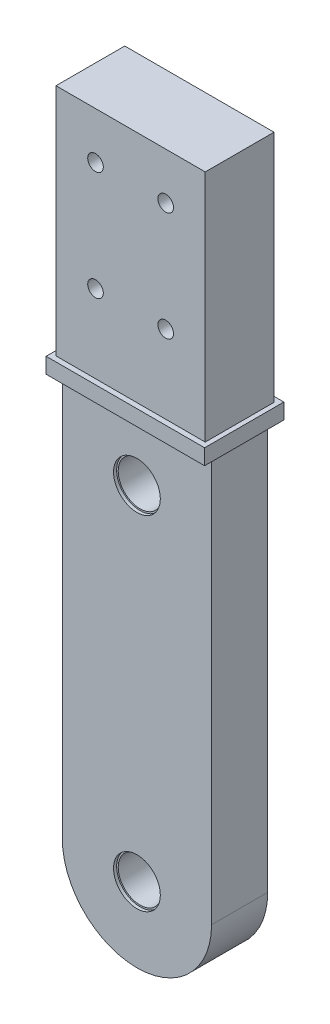
ISO-10303-21;
HEADER;
FILE_DESCRIPTION(('STEP AP214'),'2;1');
FILE_NAME('part.step','',(''),(''),'','','');
FILE_SCHEMA(('AUTOMOTIVE_DESIGN { 1 0 10303 214 1 1 1 1 }'));
ENDSEC;
DATA;
#1=APPLICATION_CONTEXT('core data for automotive mechanical design processes');
#2=APPLICATION_PROTOCOL_DEFINITION('international standard','automotive_design',2000,#1);
#3=PRODUCT_CONTEXT('',#1,'mechanical');
#4=PRODUCT('Part','Part','',(#3));
#5=PRODUCT_RELATED_PRODUCT_CATEGORY('part','',(#4));
#6=PRODUCT_DEFINITION_FORMATION('','',#4);
#7=PRODUCT_DEFINITION_CONTEXT('part definition',#1,'design');
#8=PRODUCT_DEFINITION('design','',#6,#7);
#9=PRODUCT_DEFINITION_SHAPE('','',#8);
#10=(LENGTH_UNIT() NAMED_UNIT(*) SI_UNIT(.MILLI.,.METRE.));
#11=(NAMED_UNIT(*) PLANE_ANGLE_UNIT() SI_UNIT($,.RADIAN.));
#12=(NAMED_UNIT(*) SI_UNIT($,.STERADIAN.) SOLID_ANGLE_UNIT());
#13=UNCERTAINTY_MEASURE_WITH_UNIT(LENGTH_MEASURE(1.E-05),#10,'distance_accuracy_value','');
#14=(GEOMETRIC_REPRESENTATION_CONTEXT(3) GLOBAL_UNCERTAINTY_ASSIGNED_CONTEXT((#13)) GLOBAL_UNIT_ASSIGNED_CONTEXT((#10,
#11,#12)) REPRESENTATION_CONTEXT('',''));
#15=CARTESIAN_POINT('',(0.,0.,0.));
#16=DIRECTION('',(0.,0.,1.));
#17=DIRECTION('',(1.,0.,0.));
#18=AXIS2_PLACEMENT_3D('',#15,#16,#17);
#19=CARTESIAN_POINT('',(0.,24.9999999999773,0.));
#20=DIRECTION('',(0.,1.,0.));
#21=DIRECTION('',(0.,0.,1.));
#22=AXIS2_PLACEMENT_3D('',#19,#20,#21);
#23=PLANE('',#22);
#24=DIRECTION('',(0.,0.,1.));
#25=VECTOR('',#24,1.);
#26=CARTESIAN_POINT('',(25.4,24.9999999999773,-12.7));
#27=LINE('',#26,#25);
#28=CARTESIAN_POINT('',(25.4,24.9999999999773,-12.7));
#29=VERTEX_POINT('',#28);
#30=CARTESIAN_POINT('',(25.4,24.9999999999773,12.7));
#31=VERTEX_POINT('',#30);
#32=EDGE_CURVE('E155',#29,#31,#27,.T.);
#33=ORIENTED_EDGE('',*,*,#32,.F.);
#34=DIRECTION('',(1.,0.,0.));
#35=VECTOR('',#34,1.);
#36=CARTESIAN_POINT('',(-25.4,24.9999999999773,-12.7));
#37=LINE('',#36,#35);
#38=CARTESIAN_POINT('',(-25.4,24.9999999999773,-12.7));
#39=VERTEX_POINT('',#38);
#40=EDGE_CURVE('E161',#39,#29,#37,.T.);
#41=ORIENTED_EDGE('',*,*,#40,.F.);
#42=DIRECTION('',(0.,0.,-1.));
#43=VECTOR('',#42,1.);
#44=CARTESIAN_POINT('',(-25.4,24.9999999999773,-12.7));
#45=LINE('',#44,#43);
#46=CARTESIAN_POINT('',(-25.4,24.9999999999773,12.7));
#47=VERTEX_POINT('',#46);
#48=EDGE_CURVE('E171',#47,#39,#45,.T.);
#49=ORIENTED_EDGE('',*,*,#48,.F.);
#50=DIRECTION('',(-1.,0.,0.));
#51=VECTOR('',#50,1.);
#52=CARTESIAN_POINT('',(-25.4,24.9999999999773,12.7));
#53=LINE('',#52,#51);
#54=EDGE_CURVE('E154',#31,#47,#53,.T.);
#55=ORIENTED_EDGE('',*,*,#54,.F.);
#56=EDGE_LOOP('',(#33,#41,#49,#55));
#57=FACE_BOUND('',#56,.T.);
#58=DIRECTION('',(0.,0.,-1.));
#59=VECTOR('',#58,1.);
#60=CARTESIAN_POINT('',(-23.9250000000331,24.9999999999773,9.));
#61=LINE('',#60,#59);
#62=CARTESIAN_POINT('',(-23.9250000000197,24.9999999999773,11.025));
#63=VERTEX_POINT('',#62);
#64=CARTESIAN_POINT('',(-23.9250000000197,24.9999999999773,-11.025));
#65=VERTEX_POINT('',#64);
#66=EDGE_CURVE('E50',#63,#65,#61,.T.);
#67=ORIENTED_EDGE('',*,*,#66,.T.);
#68=DIRECTION('',(-1.,0.,0.));
#69=VECTOR('',#68,1.);
#70=CARTESIAN_POINT('',(-23.9250000000197,24.9999999999773,-11.025));
#71=LINE('',#70,#69);
#72=CARTESIAN_POINT('',(23.9250000000197,24.9999999999773,-11.025));
#73=VERTEX_POINT('',#72);
#74=EDGE_CURVE('E143',#73,#65,#71,.T.);
#75=ORIENTED_EDGE('',*,*,#74,.F.);
#76=DIRECTION('',(0.,0.,1.));
#77=VECTOR('',#76,1.);
#78=CARTESIAN_POINT('',(23.9250000000197,24.9999999999773,9.));
#79=LINE('',#78,#77);
#80=CARTESIAN_POINT('',(23.9250000000197,24.9999999999773,11.025));
#81=VERTEX_POINT('',#80);
#82=EDGE_CURVE('E135',#73,#81,#79,.T.);
#83=ORIENTED_EDGE('',*,*,#82,.T.);
#84=DIRECTION('',(1.,0.,0.));
#85=VECTOR('',#84,1.);
#86=CARTESIAN_POINT('',(-23.9250000000197,24.9999999999773,11.025));
#87=LINE('',#86,#85);
#88=EDGE_CURVE('E144',#63,#81,#87,.T.);
#89=ORIENTED_EDGE('',*,*,#88,.F.);
#90=EDGE_LOOP('',(#67,#75,#83,#89));
#91=FACE_BOUND('',#90,.T.);
#92=ADVANCED_FACE('F39',(#57,#91),#23,.T.);
#93=CARTESIAN_POINT('',(0.,-110.,9.));
#94=DIRECTION('',(0.,0.,1.));
#95=DIRECTION('',(1.,0.,0.));
#96=AXIS2_PLACEMENT_3D('',#93,#94,#95);
#97=PLANE('',#96);
#98=CARTESIAN_POINT('',(0.,0.,9.));
#99=DIRECTION('',(0.,0.,1.));
#100=DIRECTION('',(1.,0.,0.));
#101=AXIS2_PLACEMENT_3D('',#98,#99,#100);
#102=CIRCLE('',#101,7.5);
#103=CARTESIAN_POINT('',(7.5,0.,9.));
#104=VERTEX_POINT('',#103);
#105=EDGE_CURVE('E204',#104,#104,#102,.T.);
#106=ORIENTED_EDGE('',*,*,#105,.F.);
#107=EDGE_LOOP('',(#106));
#108=FACE_BOUND('',#107,.T.);
#109=CARTESIAN_POINT('',(0.,-110.,9.));
#110=DIRECTION('',(0.,0.,1.));
#111=DIRECTION('',(1.,0.,0.));
#112=AXIS2_PLACEMENT_3D('',#109,#110,#111);
#113=CIRCLE('',#112,7.5);
#114=CARTESIAN_POINT('',(7.50000000000002,-110.,9.));
#115=VERTEX_POINT('',#114);
#116=EDGE_CURVE('E216',#115,#115,#113,.T.);
#117=ORIENTED_EDGE('',*,*,#116,.F.);
#118=EDGE_LOOP('',(#117));
#119=FACE_BOUND('',#118,.T.);
#120=DIRECTION('',(0.,-1.,0.));
#121=VECTOR('',#120,1.);
#122=CARTESIAN_POINT('',(23.9249999998492,-291488.30375,9.));
#123=LINE('',#122,#121);
#124=CARTESIAN_POINT('',(23.925000000033,19.9999999999773,9.));
#125=VERTEX_POINT('',#124);
#126=CARTESIAN_POINT('',(23.925000000033,-110.000000000014,9.));
#127=VERTEX_POINT('',#126);
#128=EDGE_CURVE('E251',#125,#127,#123,.T.);
#129=ORIENTED_EDGE('',*,*,#128,.F.);
#130=DIRECTION('',(-1.,0.,0.));
#131=VECTOR('',#130,1.);
#132=CARTESIAN_POINT('',(0.,19.9999999999773,9.));
#133=LINE('',#132,#131);
#134=CARTESIAN_POINT('',(-23.9250000000331,19.9999999999818,9.));
#135=VERTEX_POINT('',#134);
#136=EDGE_CURVE('E184',#125,#135,#133,.T.);
#137=ORIENTED_EDGE('',*,*,#136,.T.);
#138=DIRECTION('',(0.,1.,0.));
#139=VECTOR('',#138,1.);
#140=CARTESIAN_POINT('',(-23.9250000000197,-291488.30375,9.));
#141=LINE('',#140,#139);
#142=CARTESIAN_POINT('',(-23.925,-110.000000000014,9.));
#143=VERTEX_POINT('',#142);
#144=EDGE_CURVE('E256',#143,#135,#141,.T.);
#145=ORIENTED_EDGE('',*,*,#144,.F.);
#146=CARTESIAN_POINT('',(0.,-110.,9.));
#147=DIRECTION('',(0.,0.,1.));
#148=DIRECTION('',(1.,0.,0.));
#149=AXIS2_PLACEMENT_3D('',#146,#147,#148);
#150=CIRCLE('',#149,23.925);
#151=EDGE_CURVE('E252',#143,#127,#150,.T.);
#152=ORIENTED_EDGE('',*,*,#151,.T.);
#153=EDGE_LOOP('',(#129,#137,#145,#152));
#154=FACE_BOUND('',#153,.T.);
#155=ADVANCED_FACE('F301',(#108,#119,#154),#97,.T.);
#156=CARTESIAN_POINT('',(0.,-110.,-9.));
#157=DIRECTION('',(0.,0.,1.));
#158=DIRECTION('',(1.,0.,0.));
#159=AXIS2_PLACEMENT_3D('',#156,#157,#158);
#160=PLANE('',#159);
#161=CARTESIAN_POINT('',(0.,0.,-9.));
#162=DIRECTION('',(0.,0.,-1.));
#163=DIRECTION('',(-1.,0.,0.));
#164=AXIS2_PLACEMENT_3D('',#161,#162,#163);
#165=CIRCLE('',#164,7.5);
#166=CARTESIAN_POINT('',(-7.5,0.,-9.));
#167=VERTEX_POINT('',#166);
#168=EDGE_CURVE('E194',#167,#167,#165,.T.);
#169=ORIENTED_EDGE('',*,*,#168,.F.);
#170=EDGE_LOOP('',(#169));
#171=FACE_BOUND('',#170,.T.);
#172=CARTESIAN_POINT('',(0.,-110.,-9.));
#173=DIRECTION('',(0.,0.,-1.));
#174=DIRECTION('',(-1.,0.,0.));
#175=AXIS2_PLACEMENT_3D('',#172,#173,#174);
#176=CIRCLE('',#175,7.5);
#177=CARTESIAN_POINT('',(-7.49999999999999,-110.,-9.));
#178=VERTEX_POINT('',#177);
#179=EDGE_CURVE('E209',#178,#178,#176,.T.);
#180=ORIENTED_EDGE('',*,*,#179,.F.);
#181=EDGE_LOOP('',(#180));
#182=FACE_BOUND('',#181,.T.);
#183=DIRECTION('',(-1.,0.,0.));
#184=VECTOR('',#183,1.);
#185=CARTESIAN_POINT('',(0.,19.9999999999773,-9.));
#186=LINE('',#185,#184);
#187=CARTESIAN_POINT('',(23.925000000033,19.9999999999773,-9.));
#188=VERTEX_POINT('',#187);
#189=CARTESIAN_POINT('',(-23.9250000000331,19.9999999999818,-9.));
#190=VERTEX_POINT('',#189);
#191=EDGE_CURVE('E149',#188,#190,#186,.T.);
#192=ORIENTED_EDGE('',*,*,#191,.F.);
#193=DIRECTION('',(0.,-1.,0.));
#194=VECTOR('',#193,1.);
#195=CARTESIAN_POINT('',(23.9250000000197,-291488.30375,-9.));
#196=LINE('',#195,#194);
#197=CARTESIAN_POINT('',(23.925000000033,-110.000000000014,-9.));
#198=VERTEX_POINT('',#197);
#199=EDGE_CURVE('E246',#188,#198,#196,.T.);
#200=ORIENTED_EDGE('',*,*,#199,.T.);
#201=CARTESIAN_POINT('',(0.,-110.,-9.));
#202=DIRECTION('',(0.,0.,1.));
#203=DIRECTION('',(1.,0.,0.));
#204=AXIS2_PLACEMENT_3D('',#201,#202,#203);
#205=CIRCLE('',#204,23.925);
#206=CARTESIAN_POINT('',(-23.925,-110.000000000014,-9.));
#207=VERTEX_POINT('',#206);
#208=EDGE_CURVE('E253',#207,#198,#205,.T.);
#209=ORIENTED_EDGE('',*,*,#208,.F.);
#210=DIRECTION('',(0.,1.,0.));
#211=VECTOR('',#210,1.);
#212=CARTESIAN_POINT('',(-23.9249999998492,-291488.30375,-9.));
#213=LINE('',#212,#211);
#214=EDGE_CURVE('E265',#207,#190,#213,.T.);
#215=ORIENTED_EDGE('',*,*,#214,.T.);
#216=EDGE_LOOP('',(#192,#200,#209,#215));
#217=FACE_BOUND('',#216,.T.);
#218=ADVANCED_FACE('F307',(#171,#182,#217),#160,.F.);
#219=CARTESIAN_POINT('',(23.9250000000197,-291488.30375,9.));
#220=DIRECTION('',(1.,0.,0.));
#221=DIRECTION('',(0.,0.,-1.));
#222=AXIS2_PLACEMENT_3D('',#219,#220,#221);
#223=PLANE('',#222);
#224=ORIENTED_EDGE('',*,*,#199,.F.);
#225=DIRECTION('',(0.,0.,1.));
#226=VECTOR('',#225,1.);
#227=CARTESIAN_POINT('',(23.9250000000197,19.9999999999818,9.));
#228=LINE('',#227,#226);
#229=EDGE_CURVE('E189',#188,#125,#228,.T.);
#230=ORIENTED_EDGE('',*,*,#229,.T.);
#231=ORIENTED_EDGE('',*,*,#128,.T.);
#232=DIRECTION('',(0.,0.,-1.));
#233=VECTOR('',#232,1.);
#234=CARTESIAN_POINT('',(23.925000000033,-110.000000000014,9.));
#235=LINE('',#234,#233);
#236=EDGE_CURVE('E272',#127,#198,#235,.T.);
#237=ORIENTED_EDGE('',*,*,#236,.T.);
#238=EDGE_LOOP('',(#224,#230,#231,#237));
#239=FACE_BOUND('',#238,.T.);
#240=ADVANCED_FACE('F291',(#239),#223,.T.);
#241=CARTESIAN_POINT('',(-23.9249999998492,-291488.30375,9.));
#242=DIRECTION('',(-1.,0.,0.));
#243=DIRECTION('',(0.,-1.,0.));
#244=AXIS2_PLACEMENT_3D('',#241,#242,#243);
#245=PLANE('',#244);
#246=ORIENTED_EDGE('',*,*,#144,.T.);
#247=DIRECTION('',(0.,0.,-1.));
#248=VECTOR('',#247,1.);
#249=CARTESIAN_POINT('',(-23.9250000000331,19.9999999999818,9.));
#250=LINE('',#249,#248);
#251=EDGE_CURVE('E11',#135,#190,#250,.T.);
#252=ORIENTED_EDGE('',*,*,#251,.T.);
#253=ORIENTED_EDGE('',*,*,#214,.F.);
#254=DIRECTION('',(0.,0.,-1.));
#255=VECTOR('',#254,1.);
#256=CARTESIAN_POINT('',(-23.925,-110.000000000014,9.));
#257=LINE('',#256,#255);
#258=EDGE_CURVE('E257',#143,#207,#257,.T.);
#259=ORIENTED_EDGE('',*,*,#258,.F.);
#260=EDGE_LOOP('',(#246,#252,#253,#259));
#261=FACE_BOUND('',#260,.T.);
#262=ADVANCED_FACE('F287',(#261),#245,.T.);
#263=CARTESIAN_POINT('',(0.,0.,9.));
#264=DIRECTION('',(0.,0.,-1.));
#265=DIRECTION('',(-1.,0.,0.));
#266=AXIS2_PLACEMENT_3D('',#263,#264,#265);
#267=CYLINDRICAL_SURFACE('',#266,7.);
#268=CARTESIAN_POINT('',(0.,0.,8.));
#269=DIRECTION('',(0.,0.,1.));
#270=DIRECTION('',(1.,0.,0.));
#271=AXIS2_PLACEMENT_3D('',#268,#269,#270);
#272=CIRCLE('',#271,7.);
#273=CARTESIAN_POINT('',(7.,0.,8.));
#274=VERTEX_POINT('',#273);
#275=EDGE_CURVE('E203',#274,#274,#272,.T.);
#276=ORIENTED_EDGE('',*,*,#275,.T.);
#277=EDGE_LOOP('',(#276));
#278=FACE_BOUND('',#277,.T.);
#279=CARTESIAN_POINT('',(0.,0.,-8.));
#280=DIRECTION('',(0.,0.,-1.));
#281=DIRECTION('',(-1.,0.,0.));
#282=AXIS2_PLACEMENT_3D('',#279,#280,#281);
#283=CIRCLE('',#282,7.);
#284=CARTESIAN_POINT('',(-7.,0.,-8.));
#285=VERTEX_POINT('',#284);
#286=EDGE_CURVE('E192',#285,#285,#283,.T.);
#287=ORIENTED_EDGE('',*,*,#286,.T.);
#288=EDGE_LOOP('',(#287));
#289=FACE_BOUND('',#288,.T.);
#290=ADVANCED_FACE('F296',(#278,#289),#267,.F.);
#291=CARTESIAN_POINT('',(0.,-110.,9.));
#292=DIRECTION('',(0.,0.,-1.));
#293=DIRECTION('',(-1.,0.,0.));
#294=AXIS2_PLACEMENT_3D('',#291,#292,#293);
#295=CYLINDRICAL_SURFACE('',#294,7.);
#296=CARTESIAN_POINT('',(0.,-110.,8.));
#297=DIRECTION('',(0.,0.,1.));
#298=DIRECTION('',(1.,0.,0.));
#299=AXIS2_PLACEMENT_3D('',#296,#297,#298);
#300=CIRCLE('',#299,7.);
#301=CARTESIAN_POINT('',(7.00000000000002,-110.,8.));
#302=VERTEX_POINT('',#301);
#303=EDGE_CURVE('E212',#302,#302,#300,.T.);
#304=ORIENTED_EDGE('',*,*,#303,.T.);
#305=EDGE_LOOP('',(#304));
#306=FACE_BOUND('',#305,.T.);
#307=CARTESIAN_POINT('',(0.,-110.,-8.));
#308=DIRECTION('',(0.,0.,-1.));
#309=DIRECTION('',(-1.,0.,0.));
#310=AXIS2_PLACEMENT_3D('',#307,#308,#309);
#311=CIRCLE('',#310,7.);
#312=CARTESIAN_POINT('',(-6.99999999999999,-110.,-8.));
#313=VERTEX_POINT('',#312);
#314=EDGE_CURVE('E206',#313,#313,#311,.T.);
#315=ORIENTED_EDGE('',*,*,#314,.T.);
#316=EDGE_LOOP('',(#315));
#317=FACE_BOUND('',#316,.T.);
#318=ADVANCED_FACE('F385',(#306,#317),#295,.F.);
#319=CARTESIAN_POINT('',(0.,-110.,9.));
#320=DIRECTION('',(0.,0.,-1.));
#321=DIRECTION('',(-1.,0.,0.));
#322=AXIS2_PLACEMENT_3D('',#319,#320,#321);
#323=CYLINDRICAL_SURFACE('',#322,23.925);
#324=ORIENTED_EDGE('',*,*,#208,.T.);
#325=ORIENTED_EDGE('',*,*,#236,.F.);
#326=ORIENTED_EDGE('',*,*,#151,.F.);
#327=ORIENTED_EDGE('',*,*,#258,.T.);
#328=EDGE_LOOP('',(#324,#325,#326,#327));
#329=FACE_BOUND('',#328,.T.);
#330=ADVANCED_FACE('F365',(#329),#323,.T.);
#331=CARTESIAN_POINT('',(0.,-110.,8.));
#332=DIRECTION('',(0.,0.,1.));
#333=DIRECTION('',(1.,0.,0.));
#334=AXIS2_PLACEMENT_3D('',#331,#332,#333);
#335=CYLINDRICAL_SURFACE('',#334,7.5);
#336=CARTESIAN_POINT('',(0.,-110.,8.));
#337=DIRECTION('',(0.,0.,1.));
#338=DIRECTION('',(1.,0.,0.));
#339=AXIS2_PLACEMENT_3D('',#336,#337,#338);
#340=CIRCLE('',#339,7.5);
#341=CARTESIAN_POINT('',(7.50000000000002,-110.,8.));
#342=VERTEX_POINT('',#341);
#343=EDGE_CURVE('E211',#342,#342,#340,.T.);
#344=ORIENTED_EDGE('',*,*,#343,.F.);
#345=EDGE_LOOP('',(#344));
#346=FACE_BOUND('',#345,.T.);
#347=ORIENTED_EDGE('',*,*,#116,.T.);
#348=EDGE_LOOP('',(#347));
#349=FACE_BOUND('',#348,.T.);
#350=ADVANCED_FACE('F360',(#346,#349),#335,.F.);
#351=CARTESIAN_POINT('',(0.,-110.,8.));
#352=DIRECTION('',(0.,0.,1.));
#353=DIRECTION('',(1.,0.,0.));
#354=AXIS2_PLACEMENT_3D('',#351,#352,#353);
#355=PLANE('',#354);
#356=ORIENTED_EDGE('',*,*,#303,.F.);
#357=EDGE_LOOP('',(#356));
#358=FACE_BOUND('',#357,.T.);
#359=ORIENTED_EDGE('',*,*,#343,.T.);
#360=EDGE_LOOP('',(#359));
#361=FACE_BOUND('',#360,.T.);
#362=ADVANCED_FACE('F351',(#358,#361),#355,.T.);
#363=CARTESIAN_POINT('',(0.,-110.,-8.));
#364=DIRECTION('',(0.,0.,-1.));
#365=DIRECTION('',(-1.,0.,0.));
#366=AXIS2_PLACEMENT_3D('',#363,#364,#365);
#367=CYLINDRICAL_SURFACE('',#366,7.5);
#368=CARTESIAN_POINT('',(0.,-110.,-8.));
#369=DIRECTION('',(0.,0.,-1.));
#370=DIRECTION('',(-1.,0.,0.));
#371=AXIS2_PLACEMENT_3D('',#368,#369,#370);
#372=CIRCLE('',#371,7.5);
#373=CARTESIAN_POINT('',(-7.49999999999999,-110.,-8.));
#374=VERTEX_POINT('',#373);
#375=EDGE_CURVE('E201',#374,#374,#372,.T.);
#376=ORIENTED_EDGE('',*,*,#375,.F.);
#377=EDGE_LOOP('',(#376));
#378=FACE_BOUND('',#377,.T.);
#379=ORIENTED_EDGE('',*,*,#179,.T.);
#380=EDGE_LOOP('',(#379));
#381=FACE_BOUND('',#380,.T.);
#382=ADVANCED_FACE('F353',(#378,#381),#367,.F.);
#383=CARTESIAN_POINT('',(0.,-110.,-8.));
#384=DIRECTION('',(0.,0.,-1.));
#385=DIRECTION('',(-1.,0.,0.));
#386=AXIS2_PLACEMENT_3D('',#383,#384,#385);
#387=PLANE('',#386);
#388=ORIENTED_EDGE('',*,*,#314,.F.);
#389=EDGE_LOOP('',(#388));
#390=FACE_BOUND('',#389,.T.);
#391=ORIENTED_EDGE('',*,*,#375,.T.);
#392=EDGE_LOOP('',(#391));
#393=FACE_BOUND('',#392,.T.);
#394=ADVANCED_FACE('F350',(#390,#393),#387,.T.);
#395=CARTESIAN_POINT('',(0.,0.,8.));
#396=DIRECTION('',(0.,0.,1.));
#397=DIRECTION('',(1.,0.,0.));
#398=AXIS2_PLACEMENT_3D('',#395,#396,#397);
#399=CYLINDRICAL_SURFACE('',#398,7.5);
#400=CARTESIAN_POINT('',(0.,0.,8.));
#401=DIRECTION('',(0.,0.,1.));
#402=DIRECTION('',(1.,0.,0.));
#403=AXIS2_PLACEMENT_3D('',#400,#401,#402);
#404=CIRCLE('',#403,7.5);
#405=CARTESIAN_POINT('',(7.5,0.,8.));
#406=VERTEX_POINT('',#405);
#407=EDGE_CURVE('E197',#406,#406,#404,.T.);
#408=ORIENTED_EDGE('',*,*,#407,.F.);
#409=EDGE_LOOP('',(#408));
#410=FACE_BOUND('',#409,.T.);
#411=ORIENTED_EDGE('',*,*,#105,.T.);
#412=EDGE_LOOP('',(#411));
#413=FACE_BOUND('',#412,.T.);
#414=ADVANCED_FACE('F345',(#410,#413),#399,.F.);
#415=CARTESIAN_POINT('',(0.,0.,8.));
#416=DIRECTION('',(0.,0.,1.));
#417=DIRECTION('',(1.,0.,0.));
#418=AXIS2_PLACEMENT_3D('',#415,#416,#417);
#419=PLANE('',#418);
#420=ORIENTED_EDGE('',*,*,#275,.F.);
#421=EDGE_LOOP('',(#420));
#422=FACE_BOUND('',#421,.T.);
#423=ORIENTED_EDGE('',*,*,#407,.T.);
#424=EDGE_LOOP('',(#423));
#425=FACE_BOUND('',#424,.T.);
#426=ADVANCED_FACE('F339',(#422,#425),#419,.T.);
#427=CARTESIAN_POINT('',(0.,0.,-8.));
#428=DIRECTION('',(0.,0.,-1.));
#429=DIRECTION('',(-1.,0.,0.));
#430=AXIS2_PLACEMENT_3D('',#427,#428,#429);
#431=CYLINDRICAL_SURFACE('',#430,7.5);
#432=CARTESIAN_POINT('',(0.,0.,-8.));
#433=DIRECTION('',(0.,0.,-1.));
#434=DIRECTION('',(-1.,0.,0.));
#435=AXIS2_PLACEMENT_3D('',#432,#433,#434);
#436=CIRCLE('',#435,7.5);
#437=CARTESIAN_POINT('',(-7.5,0.,-8.));
#438=VERTEX_POINT('',#437);
#439=EDGE_CURVE('E191',#438,#438,#436,.T.);
#440=ORIENTED_EDGE('',*,*,#439,.F.);
#441=EDGE_LOOP('',(#440));
#442=FACE_BOUND('',#441,.T.);
#443=ORIENTED_EDGE('',*,*,#168,.T.);
#444=EDGE_LOOP('',(#443));
#445=FACE_BOUND('',#444,.T.);
#446=ADVANCED_FACE('F331',(#442,#445),#431,.F.);
#447=CARTESIAN_POINT('',(0.,0.,-8.));
#448=DIRECTION('',(0.,0.,-1.));
#449=DIRECTION('',(-1.,0.,0.));
#450=AXIS2_PLACEMENT_3D('',#447,#448,#449);
#451=PLANE('',#450);
#452=ORIENTED_EDGE('',*,*,#286,.F.);
#453=EDGE_LOOP('',(#452));
#454=FACE_BOUND('',#453,.T.);
#455=ORIENTED_EDGE('',*,*,#439,.T.);
#456=EDGE_LOOP('',(#455));
#457=FACE_BOUND('',#456,.T.);
#458=ADVANCED_FACE('F333',(#454,#457),#451,.T.);
#459=CARTESIAN_POINT('',(25.4,19.9999999999773,-12.7));
#460=DIRECTION('',(-1.,0.,0.));
#461=DIRECTION('',(0.,0.,1.));
#462=AXIS2_PLACEMENT_3D('',#459,#460,#461);
#463=PLANE('',#462);
#464=ORIENTED_EDGE('',*,*,#32,.T.);
#465=DIRECTION('',(0.,1.,0.));
#466=VECTOR('',#465,1.);
#467=CARTESIAN_POINT('',(25.4,19.9999999999773,12.7));
#468=LINE('',#467,#466);
#469=CARTESIAN_POINT('',(25.4,19.9999999999773,12.7));
#470=VERTEX_POINT('',#469);
#471=EDGE_CURVE('E146',#470,#31,#468,.T.);
#472=ORIENTED_EDGE('',*,*,#471,.F.);
#473=DIRECTION('',(0.,0.,1.));
#474=VECTOR('',#473,1.);
#475=CARTESIAN_POINT('',(25.4,19.9999999999773,-12.7));
#476=LINE('',#475,#474);
#477=CARTESIAN_POINT('',(25.4,19.9999999999773,-12.7));
#478=VERTEX_POINT('',#477);
#479=EDGE_CURVE('E160',#478,#470,#476,.T.);
#480=ORIENTED_EDGE('',*,*,#479,.F.);
#481=DIRECTION('',(0.,1.,0.));
#482=VECTOR('',#481,1.);
#483=CARTESIAN_POINT('',(25.4,19.9999999999773,-12.7));
#484=LINE('',#483,#482);
#485=EDGE_CURVE('E166',#478,#29,#484,.T.);
#486=ORIENTED_EDGE('',*,*,#485,.T.);
#487=EDGE_LOOP('',(#464,#472,#480,#486));
#488=FACE_BOUND('',#487,.T.);
#489=ADVANCED_FACE('F330',(#488),#463,.F.);
#490=CARTESIAN_POINT('',(-25.4,19.9999999999773,12.7));
#491=DIRECTION('',(0.,0.,-1.));
#492=DIRECTION('',(-1.,0.,0.));
#493=AXIS2_PLACEMENT_3D('',#490,#491,#492);
#494=PLANE('',#493);
#495=ORIENTED_EDGE('',*,*,#54,.T.);
#496=DIRECTION('',(0.,1.,0.));
#497=VECTOR('',#496,1.);
#498=CARTESIAN_POINT('',(-25.4,19.9999999999773,12.7));
#499=LINE('',#498,#497);
#500=CARTESIAN_POINT('',(-25.4,19.9999999999773,12.7));
#501=VERTEX_POINT('',#500);
#502=EDGE_CURVE('E177',#501,#47,#499,.T.);
#503=ORIENTED_EDGE('',*,*,#502,.F.);
#504=DIRECTION('',(-1.,0.,0.));
#505=VECTOR('',#504,1.);
#506=CARTESIAN_POINT('',(-25.4,19.9999999999773,12.7));
#507=LINE('',#506,#505);
#508=EDGE_CURVE('E162',#470,#501,#507,.T.);
#509=ORIENTED_EDGE('',*,*,#508,.F.);
#510=ORIENTED_EDGE('',*,*,#471,.T.);
#511=EDGE_LOOP('',(#495,#503,#509,#510));
#512=FACE_BOUND('',#511,.T.);
#513=ADVANCED_FACE('F325',(#512),#494,.F.);
#514=CARTESIAN_POINT('',(-25.4,19.9999999999773,-12.7));
#515=DIRECTION('',(1.,0.,0.));
#516=DIRECTION('',(0.,0.,-1.));
#517=AXIS2_PLACEMENT_3D('',#514,#515,#516);
#518=PLANE('',#517);
#519=ORIENTED_EDGE('',*,*,#48,.T.);
#520=DIRECTION('',(0.,1.,0.));
#521=VECTOR('',#520,1.);
#522=CARTESIAN_POINT('',(-25.4,19.9999999999773,-12.7));
#523=LINE('',#522,#521);
#524=CARTESIAN_POINT('',(-25.4,19.9999999999773,-12.7));
#525=VERTEX_POINT('',#524);
#526=EDGE_CURVE('E176',#525,#39,#523,.T.);
#527=ORIENTED_EDGE('',*,*,#526,.F.);
#528=DIRECTION('',(0.,0.,-1.));
#529=VECTOR('',#528,1.);
#530=CARTESIAN_POINT('',(-25.4,19.9999999999773,-12.7));
#531=LINE('',#530,#529);
#532=EDGE_CURVE('E164',#501,#525,#531,.T.);
#533=ORIENTED_EDGE('',*,*,#532,.F.);
#534=ORIENTED_EDGE('',*,*,#502,.T.);
#535=EDGE_LOOP('',(#519,#527,#533,#534));
#536=FACE_BOUND('',#535,.T.);
#537=ADVANCED_FACE('F316',(#536),#518,.F.);
#538=CARTESIAN_POINT('',(-25.4,19.9999999999773,-12.7));
#539=DIRECTION('',(0.,0.,1.));
#540=DIRECTION('',(1.,0.,0.));
#541=AXIS2_PLACEMENT_3D('',#538,#539,#540);
#542=PLANE('',#541);
#543=ORIENTED_EDGE('',*,*,#40,.T.);
#544=ORIENTED_EDGE('',*,*,#485,.F.);
#545=DIRECTION('',(1.,0.,0.));
#546=VECTOR('',#545,1.);
#547=CARTESIAN_POINT('',(-25.4,19.9999999999773,-12.7));
#548=LINE('',#547,#546);
#549=EDGE_CURVE('E170',#525,#478,#548,.T.);
#550=ORIENTED_EDGE('',*,*,#549,.F.);
#551=ORIENTED_EDGE('',*,*,#526,.T.);
#552=EDGE_LOOP('',(#543,#544,#550,#551));
#553=FACE_BOUND('',#552,.T.);
#554=ADVANCED_FACE('F317',(#553),#542,.F.);
#555=CARTESIAN_POINT('',(0.,19.9999999999773,0.));
#556=DIRECTION('',(0.,1.,0.));
#557=DIRECTION('',(0.,0.,1.));
#558=AXIS2_PLACEMENT_3D('',#555,#556,#557);
#559=PLANE('',#558);
#560=ORIENTED_EDGE('',*,*,#229,.F.);
#561=ORIENTED_EDGE('',*,*,#191,.T.);
#562=ORIENTED_EDGE('',*,*,#251,.F.);
#563=ORIENTED_EDGE('',*,*,#136,.F.);
#564=EDGE_LOOP('',(#560,#561,#562,#563));
#565=FACE_BOUND('',#564,.T.);
#566=ORIENTED_EDGE('',*,*,#479,.T.);
#567=ORIENTED_EDGE('',*,*,#508,.T.);
#568=ORIENTED_EDGE('',*,*,#532,.T.);
#569=ORIENTED_EDGE('',*,*,#549,.T.);
#570=EDGE_LOOP('',(#566,#567,#568,#569));
#571=FACE_BOUND('',#570,.T.);
#572=ADVANCED_FACE('F314',(#565,#571),#559,.F.);
#573=CARTESIAN_POINT('',(-11.25,85.,9.));
#574=DIRECTION('',(0.,0.,-1.));
#575=DIRECTION('',(-1.,0.,0.));
#576=AXIS2_PLACEMENT_3D('',#573,#574,#575);
#577=CYLINDRICAL_SURFACE('',#576,2.5);
#578=CARTESIAN_POINT('',(-11.25,85.,-11.025));
#579=DIRECTION('',(0.,0.,1.));
#580=DIRECTION('',(1.,0.,0.));
#581=AXIS2_PLACEMENT_3D('',#578,#579,#580);
#582=CIRCLE('',#581,2.5);
#583=CARTESIAN_POINT('',(-8.75,85.,-11.025));
#584=VERTEX_POINT('',#583);
#585=EDGE_CURVE('E222',#584,#584,#582,.T.);
#586=ORIENTED_EDGE('',*,*,#585,.F.);
#587=EDGE_LOOP('',(#586));
#588=FACE_BOUND('',#587,.T.);
#589=CARTESIAN_POINT('',(-11.25,85.,11.025));
#590=DIRECTION('',(0.,0.,1.));
#591=DIRECTION('',(1.,0.,0.));
#592=AXIS2_PLACEMENT_3D('',#589,#590,#591);
#593=CIRCLE('',#592,2.5);
#594=CARTESIAN_POINT('',(-8.75,85.,11.025));
#595=VERTEX_POINT('',#594);
#596=EDGE_CURVE('E218',#595,#595,#593,.T.);
#597=ORIENTED_EDGE('',*,*,#596,.T.);
#598=EDGE_LOOP('',(#597));
#599=FACE_BOUND('',#598,.T.);
#600=ADVANCED_FACE('F372',(#588,#599),#577,.F.);
#601=CARTESIAN_POINT('',(11.25,50.,9.));
#602=DIRECTION('',(0.,0.,-1.));
#603=DIRECTION('',(-1.,0.,0.));
#604=AXIS2_PLACEMENT_3D('',#601,#602,#603);
#605=CYLINDRICAL_SURFACE('',#604,2.5);
#606=CARTESIAN_POINT('',(11.25,50.,-11.025));
#607=DIRECTION('',(0.,0.,1.));
#608=DIRECTION('',(1.,0.,0.));
#609=AXIS2_PLACEMENT_3D('',#606,#607,#608);
#610=CIRCLE('',#609,2.50000000000001);
#611=CARTESIAN_POINT('',(13.75,50.,-11.025));
#612=VERTEX_POINT('',#611);
#613=EDGE_CURVE('E230',#612,#612,#610,.T.);
#614=ORIENTED_EDGE('',*,*,#613,.F.);
#615=EDGE_LOOP('',(#614));
#616=FACE_BOUND('',#615,.T.);
#617=CARTESIAN_POINT('',(11.25,50.,11.025));
#618=DIRECTION('',(0.,0.,1.));
#619=DIRECTION('',(1.,0.,0.));
#620=AXIS2_PLACEMENT_3D('',#617,#618,#619);
#621=CIRCLE('',#620,2.50000000000001);
#622=CARTESIAN_POINT('',(13.75,50.,11.025));
#623=VERTEX_POINT('',#622);
#624=EDGE_CURVE('E235',#623,#623,#621,.T.);
#625=ORIENTED_EDGE('',*,*,#624,.T.);
#626=EDGE_LOOP('',(#625));
#627=FACE_BOUND('',#626,.T.);
#628=ADVANCED_FACE('F369',(#616,#627),#605,.F.);
#629=CARTESIAN_POINT('',(-11.25,50.,9.));
#630=DIRECTION('',(0.,0.,-1.));
#631=DIRECTION('',(-1.,0.,0.));
#632=AXIS2_PLACEMENT_3D('',#629,#630,#631);
#633=CYLINDRICAL_SURFACE('',#632,2.50000000000001);
#634=CARTESIAN_POINT('',(-11.25,50.,-11.025));
#635=DIRECTION('',(0.,0.,1.));
#636=DIRECTION('',(1.,0.,0.));
#637=AXIS2_PLACEMENT_3D('',#634,#635,#636);
#638=CIRCLE('',#637,2.50000000000001);
#639=CARTESIAN_POINT('',(-8.75,50.,-11.025));
#640=VERTEX_POINT('',#639);
#641=EDGE_CURVE('E232',#640,#640,#638,.T.);
#642=ORIENTED_EDGE('',*,*,#641,.F.);
#643=EDGE_LOOP('',(#642));
#644=FACE_BOUND('',#643,.T.);
#645=CARTESIAN_POINT('',(-11.25,50.,11.025));
#646=DIRECTION('',(0.,0.,1.));
#647=DIRECTION('',(1.,0.,0.));
#648=AXIS2_PLACEMENT_3D('',#645,#646,#647);
#649=CIRCLE('',#648,2.50000000000001);
#650=CARTESIAN_POINT('',(-8.75,50.,11.025));
#651=VERTEX_POINT('',#650);
#652=EDGE_CURVE('E238',#651,#651,#649,.T.);
#653=ORIENTED_EDGE('',*,*,#652,.T.);
#654=EDGE_LOOP('',(#653));
#655=FACE_BOUND('',#654,.T.);
#656=ADVANCED_FACE('F370',(#644,#655),#633,.F.);
#657=CARTESIAN_POINT('',(11.25,85.,9.));
#658=DIRECTION('',(0.,0.,-1.));
#659=DIRECTION('',(-1.,0.,0.));
#660=AXIS2_PLACEMENT_3D('',#657,#658,#659);
#661=CYLINDRICAL_SURFACE('',#660,2.50000000000001);
#662=CARTESIAN_POINT('',(11.25,85.,-11.025));
#663=DIRECTION('',(0.,0.,1.));
#664=DIRECTION('',(1.,0.,0.));
#665=AXIS2_PLACEMENT_3D('',#662,#663,#664);
#666=CIRCLE('',#665,2.50000000000001);
#667=CARTESIAN_POINT('',(13.75,85.,-11.025));
#668=VERTEX_POINT('',#667);
#669=EDGE_CURVE('E224',#668,#668,#666,.T.);
#670=ORIENTED_EDGE('',*,*,#669,.F.);
#671=EDGE_LOOP('',(#670));
#672=FACE_BOUND('',#671,.T.);
#673=CARTESIAN_POINT('',(11.25,85.,11.025));
#674=DIRECTION('',(0.,0.,1.));
#675=DIRECTION('',(1.,0.,0.));
#676=AXIS2_PLACEMENT_3D('',#673,#674,#675);
#677=CIRCLE('',#676,2.50000000000001);
#678=CARTESIAN_POINT('',(13.75,85.,11.025));
#679=VERTEX_POINT('',#678);
#680=EDGE_CURVE('E228',#679,#679,#677,.T.);
#681=ORIENTED_EDGE('',*,*,#680,.T.);
#682=EDGE_LOOP('',(#681));
#683=FACE_BOUND('',#682,.T.);
#684=ADVANCED_FACE('F366',(#672,#683),#661,.F.);
#685=CARTESIAN_POINT('',(0.,0.,-11.025));
#686=DIRECTION('',(0.,0.,1.));
#687=DIRECTION('',(1.,0.,0.));
#688=AXIS2_PLACEMENT_3D('',#685,#686,#687);
#689=PLANE('',#688);
#690=DIRECTION('',(0.,-1.,0.));
#691=VECTOR('',#690,1.);
#692=CARTESIAN_POINT('',(-23.9250000000197,100.000000000023,-11.025));
#693=LINE('',#692,#691);
#694=CARTESIAN_POINT('',(-23.9250000000197,100.000000000023,-11.025));
#695=VERTEX_POINT('',#694);
#696=EDGE_CURVE('E53',#695,#65,#693,.T.);
#697=ORIENTED_EDGE('',*,*,#696,.F.);
#698=DIRECTION('',(-1.,0.,0.));
#699=VECTOR('',#698,1.);
#700=CARTESIAN_POINT('',(-23.9250000000197,100.000000000023,-11.025));
#701=LINE('',#700,#699);
#702=CARTESIAN_POINT('',(23.9250000000197,100.000000000023,-11.025));
#703=VERTEX_POINT('',#702);
#704=EDGE_CURVE('E243',#703,#695,#701,.T.);
#705=ORIENTED_EDGE('',*,*,#704,.F.);
#706=DIRECTION('',(0.,1.,0.));
#707=VECTOR('',#706,1.);
#708=CARTESIAN_POINT('',(23.9250000000197,100.000000000023,-11.025));
#709=LINE('',#708,#707);
#710=EDGE_CURVE('E61',#73,#703,#709,.T.);
#711=ORIENTED_EDGE('',*,*,#710,.F.);
#712=ORIENTED_EDGE('',*,*,#74,.T.);
#713=EDGE_LOOP('',(#697,#705,#711,#712));
#714=FACE_BOUND('',#713,.T.);
#715=ORIENTED_EDGE('',*,*,#641,.T.);
#716=EDGE_LOOP('',(#715));
#717=FACE_BOUND('',#716,.T.);
#718=ORIENTED_EDGE('',*,*,#613,.T.);
#719=EDGE_LOOP('',(#718));
#720=FACE_BOUND('',#719,.T.);
#721=ORIENTED_EDGE('',*,*,#669,.T.);
#722=EDGE_LOOP('',(#721));
#723=FACE_BOUND('',#722,.T.);
#724=ORIENTED_EDGE('',*,*,#585,.T.);
#725=EDGE_LOOP('',(#724));
#726=FACE_BOUND('',#725,.T.);
#727=ADVANCED_FACE('F281',(#714,#717,#720,#723,#726),#689,.F.);
#728=CARTESIAN_POINT('',(-400000.,100.000000000023,9.));
#729=DIRECTION('',(0.,1.,0.));
#730=DIRECTION('',(0.,0.,1.));
#731=AXIS2_PLACEMENT_3D('',#728,#729,#730);
#732=PLANE('',#731);
#733=DIRECTION('',(0.,0.,-1.));
#734=VECTOR('',#733,1.);
#735=CARTESIAN_POINT('',(23.9250000000197,100.000000000023,9.));
#736=LINE('',#735,#734);
#737=CARTESIAN_POINT('',(23.9250000000197,100.000000000023,11.025));
#738=VERTEX_POINT('',#737);
#739=EDGE_CURVE('E133',#738,#703,#736,.T.);
#740=ORIENTED_EDGE('',*,*,#739,.T.);
#741=ORIENTED_EDGE('',*,*,#704,.T.);
#742=DIRECTION('',(0.,0.,-1.));
#743=VECTOR('',#742,1.);
#744=CARTESIAN_POINT('',(-23.9250000000197,100.000000000023,9.));
#745=LINE('',#744,#743);
#746=CARTESIAN_POINT('',(-23.9250000000197,100.000000000023,11.025));
#747=VERTEX_POINT('',#746);
#748=EDGE_CURVE('E267',#747,#695,#745,.T.);
#749=ORIENTED_EDGE('',*,*,#748,.F.);
#750=DIRECTION('',(-1.,0.,0.));
#751=VECTOR('',#750,1.);
#752=CARTESIAN_POINT('',(-23.9250000000197,100.000000000023,11.025));
#753=LINE('',#752,#751);
#754=EDGE_CURVE('E140',#738,#747,#753,.T.);
#755=ORIENTED_EDGE('',*,*,#754,.F.);
#756=EDGE_LOOP('',(#740,#741,#749,#755));
#757=FACE_BOUND('',#756,.T.);
#758=ADVANCED_FACE('F283',(#757),#732,.T.);
#759=CARTESIAN_POINT('',(0.,0.,11.025));
#760=DIRECTION('',(0.,0.,1.));
#761=DIRECTION('',(1.,0.,0.));
#762=AXIS2_PLACEMENT_3D('',#759,#760,#761);
#763=PLANE('',#762);
#764=ORIENTED_EDGE('',*,*,#680,.F.);
#765=EDGE_LOOP('',(#764));
#766=FACE_BOUND('',#765,.T.);
#767=ORIENTED_EDGE('',*,*,#652,.F.);
#768=EDGE_LOOP('',(#767));
#769=FACE_BOUND('',#768,.T.);
#770=DIRECTION('',(0.,-1.,0.));
#771=VECTOR('',#770,1.);
#772=CARTESIAN_POINT('',(-23.9250000000197,100.000000000023,11.025));
#773=LINE('',#772,#771);
#774=EDGE_CURVE('E136',#747,#63,#773,.T.);
#775=ORIENTED_EDGE('',*,*,#774,.T.);
#776=ORIENTED_EDGE('',*,*,#88,.T.);
#777=DIRECTION('',(0.,1.,0.));
#778=VECTOR('',#777,1.);
#779=CARTESIAN_POINT('',(23.9250000000197,100.000000000023,11.025));
#780=LINE('',#779,#778);
#781=EDGE_CURVE('E127',#81,#738,#780,.T.);
#782=ORIENTED_EDGE('',*,*,#781,.T.);
#783=ORIENTED_EDGE('',*,*,#754,.T.);
#784=EDGE_LOOP('',(#775,#776,#782,#783));
#785=FACE_BOUND('',#784,.T.);
#786=ORIENTED_EDGE('',*,*,#624,.F.);
#787=EDGE_LOOP('',(#786));
#788=FACE_BOUND('',#787,.T.);
#789=ORIENTED_EDGE('',*,*,#596,.F.);
#790=EDGE_LOOP('',(#789));
#791=FACE_BOUND('',#790,.T.);
#792=ADVANCED_FACE('F148',(#766,#769,#785,#788,#791),#763,.T.);
#793=ORIENTED_EDGE('',*,*,#66,.F.);
#794=ORIENTED_EDGE('',*,*,#774,.F.);
#795=ORIENTED_EDGE('',*,*,#748,.T.);
#796=ORIENTED_EDGE('',*,*,#696,.T.);
#797=EDGE_LOOP('',(#793,#794,#795,#796));
#798=FACE_BOUND('',#797,.T.);
#799=ADVANCED_FACE('F284',(#798),#245,.T.);
#800=ORIENTED_EDGE('',*,*,#82,.F.);
#801=ORIENTED_EDGE('',*,*,#710,.T.);
#802=ORIENTED_EDGE('',*,*,#739,.F.);
#803=ORIENTED_EDGE('',*,*,#781,.F.);
#804=EDGE_LOOP('',(#800,#801,#802,#803));
#805=FACE_BOUND('',#804,.T.);
#806=ADVANCED_FACE('F41',(#805),#223,.T.);
#807=CLOSED_SHELL('',(#92,#155,#218,#240,#262,#290,#318,#330,#350,#362,#382,#394,#414,#426,#446,
#458,#489,#513,#537,#554,#572,#600,#628,#656,#684,#727,#758,#792,#799,#806));
#808=MANIFOLD_SOLID_BREP('B2',#807);
#809=ADVANCED_BREP_SHAPE_REPRESENTATION('',(#18,#808),#14);
#810=SHAPE_DEFINITION_REPRESENTATION(#9,#809);
ENDSEC;
END-ISO-10303-21;
